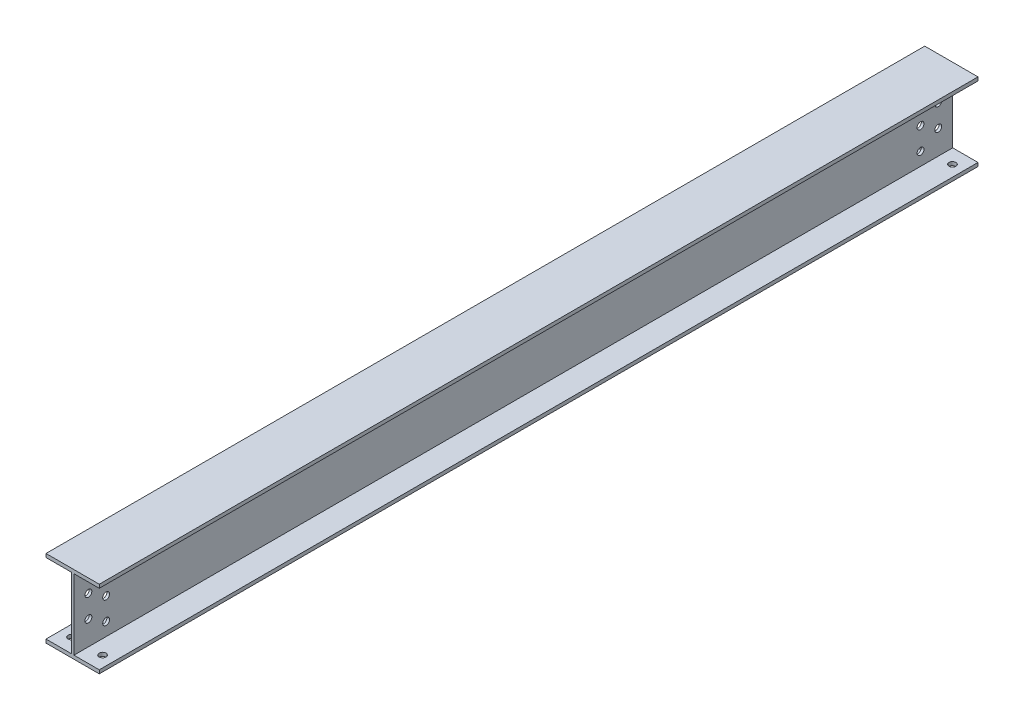
ISO-10303-21;
HEADER;
FILE_DESCRIPTION(('STEP AP214'),'2;1');
FILE_NAME('part.step','',(''),(''),'','','');
FILE_SCHEMA(('AUTOMOTIVE_DESIGN { 1 0 10303 214 1 1 1 1 }'));
ENDSEC;
DATA;
#1=APPLICATION_CONTEXT('core data for automotive mechanical design processes');
#2=APPLICATION_PROTOCOL_DEFINITION('international standard','automotive_design',2000,#1);
#3=PRODUCT_CONTEXT('',#1,'mechanical');
#4=PRODUCT('Part','Part','',(#3));
#5=PRODUCT_RELATED_PRODUCT_CATEGORY('part','',(#4));
#6=PRODUCT_DEFINITION_FORMATION('','',#4);
#7=PRODUCT_DEFINITION_CONTEXT('part definition',#1,'design');
#8=PRODUCT_DEFINITION('design','',#6,#7);
#9=PRODUCT_DEFINITION_SHAPE('','',#8);
#10=(LENGTH_UNIT() NAMED_UNIT(*) SI_UNIT(.MILLI.,.METRE.));
#11=(NAMED_UNIT(*) PLANE_ANGLE_UNIT() SI_UNIT($,.RADIAN.));
#12=(NAMED_UNIT(*) SI_UNIT($,.STERADIAN.) SOLID_ANGLE_UNIT());
#13=UNCERTAINTY_MEASURE_WITH_UNIT(LENGTH_MEASURE(1.E-05),#10,'distance_accuracy_value','');
#14=(GEOMETRIC_REPRESENTATION_CONTEXT(3) GLOBAL_UNCERTAINTY_ASSIGNED_CONTEXT((#13)) GLOBAL_UNIT_ASSIGNED_CONTEXT((#10,
#11,#12)) REPRESENTATION_CONTEXT('',''));
#15=CARTESIAN_POINT('',(0.,0.,0.));
#16=DIRECTION('',(0.,0.,1.));
#17=DIRECTION('',(1.,0.,0.));
#18=AXIS2_PLACEMENT_3D('',#15,#16,#17);
#19=CARTESIAN_POINT('',(-6.00000000000005,-159.,1980.));
#20=DIRECTION('',(1.,0.,0.));
#21=DIRECTION('',(0.,1.,0.));
#22=AXIS2_PLACEMENT_3D('',#19,#20,#21);
#23=PLANE('',#22);
#24=CARTESIAN_POINT('',(-6.00000000000002,50.,-1915.));
#25=DIRECTION('',(1.,0.,0.));
#26=DIRECTION('',(0.,1.,0.));
#27=AXIS2_PLACEMENT_3D('',#24,#25,#26);
#28=CIRCLE('',#27,15.5000000000002);
#29=CARTESIAN_POINT('',(-6.00000000000002,65.5000000000002,-1915.));
#30=VERTEX_POINT('',#29);
#31=EDGE_CURVE('E234',#30,#30,#28,.T.);
#32=ORIENTED_EDGE('',*,*,#31,.T.);
#33=EDGE_LOOP('',(#32));
#34=FACE_BOUND('',#33,.T.);
#35=CARTESIAN_POINT('',(-6.00000000000002,0.,-1835.));
#36=DIRECTION('',(1.,0.,0.));
#37=DIRECTION('',(0.,1.,0.));
#38=AXIS2_PLACEMENT_3D('',#35,#36,#37);
#39=CIRCLE('',#38,15.5000000000002);
#40=CARTESIAN_POINT('',(-6.00000000000002,15.5000000000001,-1835.));
#41=VERTEX_POINT('',#40);
#42=EDGE_CURVE('E231',#41,#41,#39,.T.);
#43=ORIENTED_EDGE('',*,*,#42,.T.);
#44=EDGE_LOOP('',(#43));
#45=FACE_BOUND('',#44,.T.);
#46=CARTESIAN_POINT('',(-6.00000000000001,100.,-1835.));
#47=DIRECTION('',(1.,0.,0.));
#48=DIRECTION('',(0.,1.,0.));
#49=AXIS2_PLACEMENT_3D('',#46,#47,#48);
#50=CIRCLE('',#49,15.5000000000002);
#51=CARTESIAN_POINT('',(-6.,115.5,-1835.));
#52=VERTEX_POINT('',#51);
#53=EDGE_CURVE('E228',#52,#52,#50,.T.);
#54=ORIENTED_EDGE('',*,*,#53,.T.);
#55=EDGE_LOOP('',(#54));
#56=FACE_BOUND('',#55,.T.);
#57=CARTESIAN_POINT('',(-6.00000000000003,-100.,-1835.));
#58=DIRECTION('',(1.,0.,0.));
#59=DIRECTION('',(0.,1.,0.));
#60=AXIS2_PLACEMENT_3D('',#57,#58,#59);
#61=CIRCLE('',#60,15.5000000000002);
#62=CARTESIAN_POINT('',(-6.00000000000003,-84.4999999999999,-1835.));
#63=VERTEX_POINT('',#62);
#64=EDGE_CURVE('E224',#63,#63,#61,.T.);
#65=ORIENTED_EDGE('',*,*,#64,.T.);
#66=EDGE_LOOP('',(#65));
#67=FACE_BOUND('',#66,.T.);
#68=CARTESIAN_POINT('',(-6.00000000000003,-50.,1915.));
#69=DIRECTION('',(1.,0.,0.));
#70=DIRECTION('',(0.,1.,0.));
#71=AXIS2_PLACEMENT_3D('',#68,#69,#70);
#72=CIRCLE('',#71,15.5000000000002);
#73=CARTESIAN_POINT('',(-6.00000000000003,-34.4999999999999,1915.));
#74=VERTEX_POINT('',#73);
#75=EDGE_CURVE('E220',#74,#74,#72,.T.);
#76=ORIENTED_EDGE('',*,*,#75,.T.);
#77=EDGE_LOOP('',(#76));
#78=FACE_BOUND('',#77,.T.);
#79=CARTESIAN_POINT('',(-6.00000000000003,-100.,1835.));
#80=DIRECTION('',(1.,0.,0.));
#81=DIRECTION('',(0.,1.,0.));
#82=AXIS2_PLACEMENT_3D('',#79,#80,#81);
#83=CIRCLE('',#82,15.5000000000002);
#84=CARTESIAN_POINT('',(-6.00000000000003,-84.4999999999999,1835.));
#85=VERTEX_POINT('',#84);
#86=EDGE_CURVE('E216',#85,#85,#83,.T.);
#87=ORIENTED_EDGE('',*,*,#86,.T.);
#88=EDGE_LOOP('',(#87));
#89=FACE_BOUND('',#88,.T.);
#90=CARTESIAN_POINT('',(-6.00000000000003,-50.,-1915.));
#91=DIRECTION('',(1.,0.,0.));
#92=DIRECTION('',(0.,1.,0.));
#93=AXIS2_PLACEMENT_3D('',#90,#91,#92);
#94=CIRCLE('',#93,15.5000000000002);
#95=CARTESIAN_POINT('',(-6.00000000000003,-34.4999999999999,-1915.));
#96=VERTEX_POINT('',#95);
#97=EDGE_CURVE('E212',#96,#96,#94,.T.);
#98=ORIENTED_EDGE('',*,*,#97,.T.);
#99=EDGE_LOOP('',(#98));
#100=FACE_BOUND('',#99,.T.);
#101=CARTESIAN_POINT('',(-6.00000000000001,100.,1835.));
#102=DIRECTION('',(1.,0.,0.));
#103=DIRECTION('',(0.,1.,0.));
#104=AXIS2_PLACEMENT_3D('',#101,#102,#103);
#105=CIRCLE('',#104,15.5000000000002);
#106=CARTESIAN_POINT('',(-6.,115.5,1835.));
#107=VERTEX_POINT('',#106);
#108=EDGE_CURVE('E208',#107,#107,#105,.T.);
#109=ORIENTED_EDGE('',*,*,#108,.T.);
#110=EDGE_LOOP('',(#109));
#111=FACE_BOUND('',#110,.T.);
#112=CARTESIAN_POINT('',(-6.00000000000002,0.,1835.));
#113=DIRECTION('',(1.,0.,0.));
#114=DIRECTION('',(0.,1.,0.));
#115=AXIS2_PLACEMENT_3D('',#112,#113,#114);
#116=CIRCLE('',#115,15.5000000000002);
#117=CARTESIAN_POINT('',(-6.00000000000002,15.5000000000001,1835.));
#118=VERTEX_POINT('',#117);
#119=EDGE_CURVE('E204',#118,#118,#116,.T.);
#120=ORIENTED_EDGE('',*,*,#119,.T.);
#121=EDGE_LOOP('',(#120));
#122=FACE_BOUND('',#121,.T.);
#123=CARTESIAN_POINT('',(-6.00000000000002,50.,1915.));
#124=DIRECTION('',(1.,0.,0.));
#125=DIRECTION('',(0.,1.,0.));
#126=AXIS2_PLACEMENT_3D('',#123,#124,#125);
#127=CIRCLE('',#126,15.5000000000002);
#128=CARTESIAN_POINT('',(-6.00000000000002,65.5000000000002,1915.));
#129=VERTEX_POINT('',#128);
#130=EDGE_CURVE('E158',#129,#129,#127,.T.);
#131=ORIENTED_EDGE('',*,*,#130,.T.);
#132=EDGE_LOOP('',(#131));
#133=FACE_BOUND('',#132,.T.);
#134=DIRECTION('',(0.,-1.,0.));
#135=VECTOR('',#134,1.);
#136=CARTESIAN_POINT('',(-6.00000000000005,-159.,-1980.));
#137=LINE('',#136,#135);
#138=CARTESIAN_POINT('',(-6.,159.,-1980.));
#139=VERTEX_POINT('',#138);
#140=CARTESIAN_POINT('',(-6.00000000000005,-159.,-1980.));
#141=VERTEX_POINT('',#140);
#142=EDGE_CURVE('E154',#139,#141,#137,.T.);
#143=ORIENTED_EDGE('',*,*,#142,.T.);
#144=DIRECTION('',(0.,0.,-1.));
#145=VECTOR('',#144,1.);
#146=CARTESIAN_POINT('',(-6.00000000000005,-159.,1980.));
#147=LINE('',#146,#145);
#148=CARTESIAN_POINT('',(-6.00000000000005,-159.,1980.));
#149=VERTEX_POINT('',#148);
#150=EDGE_CURVE('E11',#149,#141,#147,.T.);
#151=ORIENTED_EDGE('',*,*,#150,.F.);
#152=DIRECTION('',(0.,-1.,0.));
#153=VECTOR('',#152,1.);
#154=CARTESIAN_POINT('',(-6.00000000000005,-159.,1980.));
#155=LINE('',#154,#153);
#156=CARTESIAN_POINT('',(-6.,159.,1980.));
#157=VERTEX_POINT('',#156);
#158=EDGE_CURVE('E177',#157,#149,#155,.T.);
#159=ORIENTED_EDGE('',*,*,#158,.F.);
#160=DIRECTION('',(0.,0.,-1.));
#161=VECTOR('',#160,1.);
#162=CARTESIAN_POINT('',(-6.,159.,1980.));
#163=LINE('',#162,#161);
#164=EDGE_CURVE('E150',#157,#139,#163,.T.);
#165=ORIENTED_EDGE('',*,*,#164,.T.);
#166=EDGE_LOOP('',(#143,#151,#159,#165));
#167=FACE_BOUND('',#166,.T.);
#168=ADVANCED_FACE('F32',(#34,#45,#56,#67,#78,#89,#100,#111,#122,#133,#167),#23,.F.);
#169=CARTESIAN_POINT('',(-120.,-159.,1980.));
#170=DIRECTION('',(0.,-1.,0.));
#171=DIRECTION('',(0.,0.,-1.));
#172=AXIS2_PLACEMENT_3D('',#169,#170,#171);
#173=PLANE('',#172);
#174=CARTESIAN_POINT('',(-70.,-159.,1915.));
#175=DIRECTION('',(0.,1.,0.));
#176=DIRECTION('',(0.,0.,-1.));
#177=AXIS2_PLACEMENT_3D('',#174,#175,#176);
#178=CIRCLE('',#177,15.5);
#179=CARTESIAN_POINT('',(-70.,-159.,1899.5));
#180=VERTEX_POINT('',#179);
#181=EDGE_CURVE('E399',#180,#180,#178,.T.);
#182=ORIENTED_EDGE('',*,*,#181,.F.);
#183=EDGE_LOOP('',(#182));
#184=FACE_BOUND('',#183,.T.);
#185=CARTESIAN_POINT('',(-70.,-159.,-1915.));
#186=DIRECTION('',(0.,1.,0.));
#187=DIRECTION('',(0.,0.,1.));
#188=AXIS2_PLACEMENT_3D('',#185,#186,#187);
#189=CIRCLE('',#188,15.5);
#190=CARTESIAN_POINT('',(-70.,-159.,-1899.5));
#191=VERTEX_POINT('',#190);
#192=EDGE_CURVE('E246',#191,#191,#189,.T.);
#193=ORIENTED_EDGE('',*,*,#192,.F.);
#194=EDGE_LOOP('',(#193));
#195=FACE_BOUND('',#194,.T.);
#196=DIRECTION('',(-1.,0.,0.));
#197=VECTOR('',#196,1.);
#198=CARTESIAN_POINT('',(-120.,-159.,-1980.));
#199=LINE('',#198,#197);
#200=CARTESIAN_POINT('',(-120.,-159.,-1980.));
#201=VERTEX_POINT('',#200);
#202=EDGE_CURVE('E157',#141,#201,#199,.T.);
#203=ORIENTED_EDGE('',*,*,#202,.T.);
#204=DIRECTION('',(0.,0.,-1.));
#205=VECTOR('',#204,1.);
#206=CARTESIAN_POINT('',(-120.,-159.,1980.));
#207=LINE('',#206,#205);
#208=CARTESIAN_POINT('',(-120.,-159.,1980.));
#209=VERTEX_POINT('',#208);
#210=EDGE_CURVE('E41',#209,#201,#207,.T.);
#211=ORIENTED_EDGE('',*,*,#210,.F.);
#212=DIRECTION('',(-1.,0.,0.));
#213=VECTOR('',#212,1.);
#214=CARTESIAN_POINT('',(-120.,-159.,1980.));
#215=LINE('',#214,#213);
#216=EDGE_CURVE('E105',#149,#209,#215,.T.);
#217=ORIENTED_EDGE('',*,*,#216,.F.);
#218=ORIENTED_EDGE('',*,*,#150,.T.);
#219=EDGE_LOOP('',(#203,#211,#217,#218));
#220=FACE_BOUND('',#219,.T.);
#221=ADVANCED_FACE('F306',(#184,#195,#220),#173,.F.);
#222=CARTESIAN_POINT('',(-120.,-175.,1980.));
#223=DIRECTION('',(1.,0.,0.));
#224=DIRECTION('',(0.,0.,-1.));
#225=AXIS2_PLACEMENT_3D('',#222,#223,#224);
#226=PLANE('',#225);
#227=DIRECTION('',(0.,-1.,0.));
#228=VECTOR('',#227,1.);
#229=CARTESIAN_POINT('',(-120.,-175.,-1980.));
#230=LINE('',#229,#228);
#231=CARTESIAN_POINT('',(-120.,-175.,-1980.));
#232=VERTEX_POINT('',#231);
#233=EDGE_CURVE('E160',#201,#232,#230,.T.);
#234=ORIENTED_EDGE('',*,*,#233,.T.);
#235=DIRECTION('',(0.,0.,-1.));
#236=VECTOR('',#235,1.);
#237=CARTESIAN_POINT('',(-120.,-175.,1980.));
#238=LINE('',#237,#236);
#239=CARTESIAN_POINT('',(-120.,-175.,1980.));
#240=VERTEX_POINT('',#239);
#241=EDGE_CURVE('E196',#240,#232,#238,.T.);
#242=ORIENTED_EDGE('',*,*,#241,.F.);
#243=DIRECTION('',(0.,-1.,0.));
#244=VECTOR('',#243,1.);
#245=CARTESIAN_POINT('',(-120.,-175.,1980.));
#246=LINE('',#245,#244);
#247=EDGE_CURVE('E267',#209,#240,#246,.T.);
#248=ORIENTED_EDGE('',*,*,#247,.F.);
#249=ORIENTED_EDGE('',*,*,#210,.T.);
#250=EDGE_LOOP('',(#234,#242,#248,#249));
#251=FACE_BOUND('',#250,.T.);
#252=ADVANCED_FACE('F310',(#251),#226,.F.);
#253=CARTESIAN_POINT('',(120.,-175.,1980.));
#254=DIRECTION('',(0.,1.,0.));
#255=DIRECTION('',(-1.,0.,0.));
#256=AXIS2_PLACEMENT_3D('',#253,#254,#255);
#257=PLANE('',#256);
#258=CARTESIAN_POINT('',(-70.,-175.,1915.));
#259=DIRECTION('',(0.,1.,0.));
#260=DIRECTION('',(0.,0.,-1.));
#261=AXIS2_PLACEMENT_3D('',#258,#259,#260);
#262=CIRCLE('',#261,15.5);
#263=CARTESIAN_POINT('',(-70.,-175.,1899.5));
#264=VERTEX_POINT('',#263);
#265=EDGE_CURVE('E396',#264,#264,#262,.T.);
#266=ORIENTED_EDGE('',*,*,#265,.T.);
#267=EDGE_LOOP('',(#266));
#268=FACE_BOUND('',#267,.T.);
#269=CARTESIAN_POINT('',(70.,-175.,1915.));
#270=DIRECTION('',(0.,1.,0.));
#271=DIRECTION('',(0.,0.,-1.));
#272=AXIS2_PLACEMENT_3D('',#269,#270,#271);
#273=CIRCLE('',#272,15.5);
#274=CARTESIAN_POINT('',(70.,-175.,1899.5));
#275=VERTEX_POINT('',#274);
#276=EDGE_CURVE('E404',#275,#275,#273,.T.);
#277=ORIENTED_EDGE('',*,*,#276,.T.);
#278=EDGE_LOOP('',(#277));
#279=FACE_BOUND('',#278,.T.);
#280=CARTESIAN_POINT('',(70.,-175.,-1915.));
#281=DIRECTION('',(0.,1.,0.));
#282=DIRECTION('',(0.,0.,1.));
#283=AXIS2_PLACEMENT_3D('',#280,#281,#282);
#284=CIRCLE('',#283,15.5);
#285=CARTESIAN_POINT('',(70.,-175.,-1899.5));
#286=VERTEX_POINT('',#285);
#287=EDGE_CURVE('E410',#286,#286,#284,.T.);
#288=ORIENTED_EDGE('',*,*,#287,.T.);
#289=EDGE_LOOP('',(#288));
#290=FACE_BOUND('',#289,.T.);
#291=CARTESIAN_POINT('',(-70.,-175.,-1915.));
#292=DIRECTION('',(0.,1.,0.));
#293=DIRECTION('',(0.,0.,1.));
#294=AXIS2_PLACEMENT_3D('',#291,#292,#293);
#295=CIRCLE('',#294,15.5);
#296=CARTESIAN_POINT('',(-70.,-175.,-1899.5));
#297=VERTEX_POINT('',#296);
#298=EDGE_CURVE('E244',#297,#297,#295,.T.);
#299=ORIENTED_EDGE('',*,*,#298,.T.);
#300=EDGE_LOOP('',(#299));
#301=FACE_BOUND('',#300,.T.);
#302=DIRECTION('',(1.,0.,0.));
#303=VECTOR('',#302,1.);
#304=CARTESIAN_POINT('',(120.,-175.,-1980.));
#305=LINE('',#304,#303);
#306=CARTESIAN_POINT('',(120.,-175.,-1980.));
#307=VERTEX_POINT('',#306);
#308=EDGE_CURVE('E162',#232,#307,#305,.T.);
#309=ORIENTED_EDGE('',*,*,#308,.T.);
#310=DIRECTION('',(0.,0.,-1.));
#311=VECTOR('',#310,1.);
#312=CARTESIAN_POINT('',(120.,-175.,1980.));
#313=LINE('',#312,#311);
#314=CARTESIAN_POINT('',(120.,-175.,1980.));
#315=VERTEX_POINT('',#314);
#316=EDGE_CURVE('E193',#315,#307,#313,.T.);
#317=ORIENTED_EDGE('',*,*,#316,.F.);
#318=DIRECTION('',(1.,0.,0.));
#319=VECTOR('',#318,1.);
#320=CARTESIAN_POINT('',(120.,-175.,1980.));
#321=LINE('',#320,#319);
#322=EDGE_CURVE('E269',#240,#315,#321,.T.);
#323=ORIENTED_EDGE('',*,*,#322,.F.);
#324=ORIENTED_EDGE('',*,*,#241,.T.);
#325=EDGE_LOOP('',(#309,#317,#323,#324));
#326=FACE_BOUND('',#325,.T.);
#327=ADVANCED_FACE('F429',(#268,#279,#290,#301,#326),#257,.F.);
#328=CARTESIAN_POINT('',(120.,-159.,1980.));
#329=DIRECTION('',(-1.,0.,0.));
#330=DIRECTION('',(0.,0.,1.));
#331=AXIS2_PLACEMENT_3D('',#328,#329,#330);
#332=PLANE('',#331);
#333=DIRECTION('',(0.,1.,0.));
#334=VECTOR('',#333,1.);
#335=CARTESIAN_POINT('',(120.,-159.,-1980.));
#336=LINE('',#335,#334);
#337=CARTESIAN_POINT('',(120.,-159.,-1980.));
#338=VERTEX_POINT('',#337);
#339=EDGE_CURVE('E164',#307,#338,#336,.T.);
#340=ORIENTED_EDGE('',*,*,#339,.T.);
#341=DIRECTION('',(0.,0.,-1.));
#342=VECTOR('',#341,1.);
#343=CARTESIAN_POINT('',(120.,-159.,1980.));
#344=LINE('',#343,#342);
#345=CARTESIAN_POINT('',(120.,-159.,1980.));
#346=VERTEX_POINT('',#345);
#347=EDGE_CURVE('E190',#346,#338,#344,.T.);
#348=ORIENTED_EDGE('',*,*,#347,.F.);
#349=DIRECTION('',(0.,1.,0.));
#350=VECTOR('',#349,1.);
#351=CARTESIAN_POINT('',(120.,-159.,1980.));
#352=LINE('',#351,#350);
#353=EDGE_CURVE('E271',#315,#346,#352,.T.);
#354=ORIENTED_EDGE('',*,*,#353,.F.);
#355=ORIENTED_EDGE('',*,*,#316,.T.);
#356=EDGE_LOOP('',(#340,#348,#354,#355));
#357=FACE_BOUND('',#356,.T.);
#358=ADVANCED_FACE('F433',(#357),#332,.F.);
#359=CARTESIAN_POINT('',(6.00000000000005,-159.,1980.));
#360=DIRECTION('',(0.,-1.,0.));
#361=DIRECTION('',(1.,0.,0.));
#362=AXIS2_PLACEMENT_3D('',#359,#360,#361);
#363=PLANE('',#362);
#364=CARTESIAN_POINT('',(70.,-159.,1915.));
#365=DIRECTION('',(0.,1.,0.));
#366=DIRECTION('',(0.,0.,-1.));
#367=AXIS2_PLACEMENT_3D('',#364,#365,#366);
#368=CIRCLE('',#367,15.5);
#369=CARTESIAN_POINT('',(70.,-159.,1899.5));
#370=VERTEX_POINT('',#369);
#371=EDGE_CURVE('E401',#370,#370,#368,.T.);
#372=ORIENTED_EDGE('',*,*,#371,.F.);
#373=EDGE_LOOP('',(#372));
#374=FACE_BOUND('',#373,.T.);
#375=CARTESIAN_POINT('',(70.,-159.,-1915.));
#376=DIRECTION('',(0.,1.,0.));
#377=DIRECTION('',(0.,0.,1.));
#378=AXIS2_PLACEMENT_3D('',#375,#376,#377);
#379=CIRCLE('',#378,15.5);
#380=CARTESIAN_POINT('',(70.,-159.,-1899.5));
#381=VERTEX_POINT('',#380);
#382=EDGE_CURVE('E407',#381,#381,#379,.T.);
#383=ORIENTED_EDGE('',*,*,#382,.F.);
#384=EDGE_LOOP('',(#383));
#385=FACE_BOUND('',#384,.T.);
#386=DIRECTION('',(-1.,0.,0.));
#387=VECTOR('',#386,1.);
#388=CARTESIAN_POINT('',(6.00000000000005,-159.,-1980.));
#389=LINE('',#388,#387);
#390=CARTESIAN_POINT('',(6.00000000000005,-159.,-1980.));
#391=VERTEX_POINT('',#390);
#392=EDGE_CURVE('E166',#338,#391,#389,.T.);
#393=ORIENTED_EDGE('',*,*,#392,.T.);
#394=DIRECTION('',(0.,0.,-1.));
#395=VECTOR('',#394,1.);
#396=CARTESIAN_POINT('',(6.00000000000005,-159.,1980.));
#397=LINE('',#396,#395);
#398=CARTESIAN_POINT('',(6.00000000000005,-159.,1980.));
#399=VERTEX_POINT('',#398);
#400=EDGE_CURVE('E187',#399,#391,#397,.T.);
#401=ORIENTED_EDGE('',*,*,#400,.F.);
#402=DIRECTION('',(-1.,0.,0.));
#403=VECTOR('',#402,1.);
#404=CARTESIAN_POINT('',(6.00000000000005,-159.,1980.));
#405=LINE('',#404,#403);
#406=EDGE_CURVE('E273',#346,#399,#405,.T.);
#407=ORIENTED_EDGE('',*,*,#406,.F.);
#408=ORIENTED_EDGE('',*,*,#347,.T.);
#409=EDGE_LOOP('',(#393,#401,#407,#408));
#410=FACE_BOUND('',#409,.T.);
#411=ADVANCED_FACE('F438',(#374,#385,#410),#363,.F.);
#412=CARTESIAN_POINT('',(6.,159.,1980.));
#413=DIRECTION('',(-1.,0.,0.));
#414=DIRECTION('',(0.,-1.,0.));
#415=AXIS2_PLACEMENT_3D('',#412,#413,#414);
#416=PLANE('',#415);
#417=CARTESIAN_POINT('',(6.00000000000003,50.,-1915.));
#418=DIRECTION('',(-1.,0.,0.));
#419=DIRECTION('',(0.,-1.,0.));
#420=AXIS2_PLACEMENT_3D('',#417,#418,#419);
#421=CIRCLE('',#420,15.5000000000002);
#422=CARTESIAN_POINT('',(6.00000000000004,34.4999999999998,-1915.));
#423=VERTEX_POINT('',#422);
#424=EDGE_CURVE('E35',#423,#423,#421,.T.);
#425=ORIENTED_EDGE('',*,*,#424,.T.);
#426=EDGE_LOOP('',(#425));
#427=FACE_BOUND('',#426,.T.);
#428=CARTESIAN_POINT('',(6.00000000000003,0.,-1835.));
#429=DIRECTION('',(-1.,0.,0.));
#430=DIRECTION('',(0.,-1.,0.));
#431=AXIS2_PLACEMENT_3D('',#428,#429,#430);
#432=CIRCLE('',#431,15.5000000000002);
#433=CARTESIAN_POINT('',(6.00000000000004,-15.5000000000002,-1835.));
#434=VERTEX_POINT('',#433);
#435=EDGE_CURVE('E232',#434,#434,#432,.T.);
#436=ORIENTED_EDGE('',*,*,#435,.T.);
#437=EDGE_LOOP('',(#436));
#438=FACE_BOUND('',#437,.T.);
#439=CARTESIAN_POINT('',(6.00000000000001,100.,-1835.));
#440=DIRECTION('',(-1.,0.,0.));
#441=DIRECTION('',(0.,-1.,0.));
#442=AXIS2_PLACEMENT_3D('',#439,#440,#441);
#443=CIRCLE('',#442,15.5000000000002);
#444=CARTESIAN_POINT('',(6.00000000000001,84.4999999999998,-1835.));
#445=VERTEX_POINT('',#444);
#446=EDGE_CURVE('E229',#445,#445,#443,.T.);
#447=ORIENTED_EDGE('',*,*,#446,.T.);
#448=EDGE_LOOP('',(#447));
#449=FACE_BOUND('',#448,.T.);
#450=CARTESIAN_POINT('',(6.00000000000003,-100.,-1835.));
#451=DIRECTION('',(-1.,0.,0.));
#452=DIRECTION('',(0.,-1.,0.));
#453=AXIS2_PLACEMENT_3D('',#450,#451,#452);
#454=CIRCLE('',#453,15.5000000000002);
#455=CARTESIAN_POINT('',(6.00000000000004,-115.5,-1835.));
#456=VERTEX_POINT('',#455);
#457=EDGE_CURVE('E225',#456,#456,#454,.T.);
#458=ORIENTED_EDGE('',*,*,#457,.T.);
#459=EDGE_LOOP('',(#458));
#460=FACE_BOUND('',#459,.T.);
#461=CARTESIAN_POINT('',(6.00000000000003,-50.,1915.));
#462=DIRECTION('',(-1.,0.,0.));
#463=DIRECTION('',(0.,-1.,0.));
#464=AXIS2_PLACEMENT_3D('',#461,#462,#463);
#465=CIRCLE('',#464,15.5000000000002);
#466=CARTESIAN_POINT('',(6.00000000000004,-65.5000000000002,1915.));
#467=VERTEX_POINT('',#466);
#468=EDGE_CURVE('E221',#467,#467,#465,.T.);
#469=ORIENTED_EDGE('',*,*,#468,.T.);
#470=EDGE_LOOP('',(#469));
#471=FACE_BOUND('',#470,.T.);
#472=CARTESIAN_POINT('',(6.00000000000003,-100.,1835.));
#473=DIRECTION('',(-1.,0.,0.));
#474=DIRECTION('',(0.,-1.,0.));
#475=AXIS2_PLACEMENT_3D('',#472,#473,#474);
#476=CIRCLE('',#475,15.5000000000002);
#477=CARTESIAN_POINT('',(6.00000000000004,-115.5,1835.));
#478=VERTEX_POINT('',#477);
#479=EDGE_CURVE('E217',#478,#478,#476,.T.);
#480=ORIENTED_EDGE('',*,*,#479,.T.);
#481=EDGE_LOOP('',(#480));
#482=FACE_BOUND('',#481,.T.);
#483=CARTESIAN_POINT('',(6.00000000000003,-50.,-1915.));
#484=DIRECTION('',(-1.,0.,0.));
#485=DIRECTION('',(0.,-1.,0.));
#486=AXIS2_PLACEMENT_3D('',#483,#484,#485);
#487=CIRCLE('',#486,15.5000000000002);
#488=CARTESIAN_POINT('',(6.00000000000004,-65.5000000000002,-1915.));
#489=VERTEX_POINT('',#488);
#490=EDGE_CURVE('E213',#489,#489,#487,.T.);
#491=ORIENTED_EDGE('',*,*,#490,.T.);
#492=EDGE_LOOP('',(#491));
#493=FACE_BOUND('',#492,.T.);
#494=CARTESIAN_POINT('',(6.00000000000001,100.,1835.));
#495=DIRECTION('',(-1.,0.,0.));
#496=DIRECTION('',(0.,-1.,0.));
#497=AXIS2_PLACEMENT_3D('',#494,#495,#496);
#498=CIRCLE('',#497,15.5000000000002);
#499=CARTESIAN_POINT('',(6.00000000000001,84.4999999999998,1835.));
#500=VERTEX_POINT('',#499);
#501=EDGE_CURVE('E209',#500,#500,#498,.T.);
#502=ORIENTED_EDGE('',*,*,#501,.T.);
#503=EDGE_LOOP('',(#502));
#504=FACE_BOUND('',#503,.T.);
#505=CARTESIAN_POINT('',(6.00000000000003,0.,1835.));
#506=DIRECTION('',(-1.,0.,0.));
#507=DIRECTION('',(0.,-1.,0.));
#508=AXIS2_PLACEMENT_3D('',#505,#506,#507);
#509=CIRCLE('',#508,15.5000000000002);
#510=CARTESIAN_POINT('',(6.00000000000004,-15.5000000000002,1835.));
#511=VERTEX_POINT('',#510);
#512=EDGE_CURVE('E205',#511,#511,#509,.T.);
#513=ORIENTED_EDGE('',*,*,#512,.T.);
#514=EDGE_LOOP('',(#513));
#515=FACE_BOUND('',#514,.T.);
#516=CARTESIAN_POINT('',(6.00000000000003,50.,1915.));
#517=DIRECTION('',(-1.,0.,0.));
#518=DIRECTION('',(0.,-1.,0.));
#519=AXIS2_PLACEMENT_3D('',#516,#517,#518);
#520=CIRCLE('',#519,15.5000000000002);
#521=CARTESIAN_POINT('',(6.00000000000004,34.4999999999998,1915.));
#522=VERTEX_POINT('',#521);
#523=EDGE_CURVE('E201',#522,#522,#520,.T.);
#524=ORIENTED_EDGE('',*,*,#523,.T.);
#525=EDGE_LOOP('',(#524));
#526=FACE_BOUND('',#525,.T.);
#527=DIRECTION('',(0.,1.,0.));
#528=VECTOR('',#527,1.);
#529=CARTESIAN_POINT('',(6.,159.,-1980.));
#530=LINE('',#529,#528);
#531=CARTESIAN_POINT('',(6.,159.,-1980.));
#532=VERTEX_POINT('',#531);
#533=EDGE_CURVE('E168',#391,#532,#530,.T.);
#534=ORIENTED_EDGE('',*,*,#533,.T.);
#535=DIRECTION('',(0.,0.,-1.));
#536=VECTOR('',#535,1.);
#537=CARTESIAN_POINT('',(6.,159.,1980.));
#538=LINE('',#537,#536);
#539=CARTESIAN_POINT('',(6.,159.,1980.));
#540=VERTEX_POINT('',#539);
#541=EDGE_CURVE('E184',#540,#532,#538,.T.);
#542=ORIENTED_EDGE('',*,*,#541,.F.);
#543=DIRECTION('',(0.,1.,0.));
#544=VECTOR('',#543,1.);
#545=CARTESIAN_POINT('',(6.,159.,1980.));
#546=LINE('',#545,#544);
#547=EDGE_CURVE('E275',#399,#540,#546,.T.);
#548=ORIENTED_EDGE('',*,*,#547,.F.);
#549=ORIENTED_EDGE('',*,*,#400,.T.);
#550=EDGE_LOOP('',(#534,#542,#548,#549));
#551=FACE_BOUND('',#550,.T.);
#552=ADVANCED_FACE('F441',(#427,#438,#449,#460,#471,#482,#493,#504,#515,#526,#551),#416,.F.);
#553=CARTESIAN_POINT('',(120.,159.,1980.));
#554=DIRECTION('',(0.,1.,0.));
#555=DIRECTION('',(0.,0.,1.));
#556=AXIS2_PLACEMENT_3D('',#553,#554,#555);
#557=PLANE('',#556);
#558=DIRECTION('',(1.,0.,0.));
#559=VECTOR('',#558,1.);
#560=CARTESIAN_POINT('',(120.,159.,-1980.));
#561=LINE('',#560,#559);
#562=CARTESIAN_POINT('',(120.,159.,-1980.));
#563=VERTEX_POINT('',#562);
#564=EDGE_CURVE('E170',#532,#563,#561,.T.);
#565=ORIENTED_EDGE('',*,*,#564,.T.);
#566=DIRECTION('',(0.,0.,-1.));
#567=VECTOR('',#566,1.);
#568=CARTESIAN_POINT('',(120.,159.,1980.));
#569=LINE('',#568,#567);
#570=CARTESIAN_POINT('',(120.,159.,1980.));
#571=VERTEX_POINT('',#570);
#572=EDGE_CURVE('E181',#571,#563,#569,.T.);
#573=ORIENTED_EDGE('',*,*,#572,.F.);
#574=DIRECTION('',(1.,0.,0.));
#575=VECTOR('',#574,1.);
#576=CARTESIAN_POINT('',(120.,159.,1980.));
#577=LINE('',#576,#575);
#578=EDGE_CURVE('E277',#540,#571,#577,.T.);
#579=ORIENTED_EDGE('',*,*,#578,.F.);
#580=ORIENTED_EDGE('',*,*,#541,.T.);
#581=EDGE_LOOP('',(#565,#573,#579,#580));
#582=FACE_BOUND('',#581,.T.);
#583=ADVANCED_FACE('F283',(#582),#557,.F.);
#584=CARTESIAN_POINT('',(120.,175.,1980.));
#585=DIRECTION('',(-1.,0.,0.));
#586=DIRECTION('',(0.,0.,1.));
#587=AXIS2_PLACEMENT_3D('',#584,#585,#586);
#588=PLANE('',#587);
#589=DIRECTION('',(0.,1.,0.));
#590=VECTOR('',#589,1.);
#591=CARTESIAN_POINT('',(120.,175.,-1980.));
#592=LINE('',#591,#590);
#593=CARTESIAN_POINT('',(120.,175.,-1980.));
#594=VERTEX_POINT('',#593);
#595=EDGE_CURVE('E172',#563,#594,#592,.T.);
#596=ORIENTED_EDGE('',*,*,#595,.T.);
#597=DIRECTION('',(0.,0.,-1.));
#598=VECTOR('',#597,1.);
#599=CARTESIAN_POINT('',(120.,175.,1980.));
#600=LINE('',#599,#598);
#601=CARTESIAN_POINT('',(120.,175.,1980.));
#602=VERTEX_POINT('',#601);
#603=EDGE_CURVE('E145',#602,#594,#600,.T.);
#604=ORIENTED_EDGE('',*,*,#603,.F.);
#605=DIRECTION('',(0.,1.,0.));
#606=VECTOR('',#605,1.);
#607=CARTESIAN_POINT('',(120.,175.,1980.));
#608=LINE('',#607,#606);
#609=EDGE_CURVE('E136',#571,#602,#608,.T.);
#610=ORIENTED_EDGE('',*,*,#609,.F.);
#611=ORIENTED_EDGE('',*,*,#572,.T.);
#612=EDGE_LOOP('',(#596,#604,#610,#611));
#613=FACE_BOUND('',#612,.T.);
#614=ADVANCED_FACE('F287',(#613),#588,.F.);
#615=CARTESIAN_POINT('',(-120.,175.,1980.));
#616=DIRECTION('',(0.,-1.,0.));
#617=DIRECTION('',(0.,0.,-1.));
#618=AXIS2_PLACEMENT_3D('',#615,#616,#617);
#619=PLANE('',#618);
#620=DIRECTION('',(-1.,0.,0.));
#621=VECTOR('',#620,1.);
#622=CARTESIAN_POINT('',(-120.,175.,-1980.));
#623=LINE('',#622,#621);
#624=CARTESIAN_POINT('',(-120.,175.,-1980.));
#625=VERTEX_POINT('',#624);
#626=EDGE_CURVE('E144',#594,#625,#623,.T.);
#627=ORIENTED_EDGE('',*,*,#626,.T.);
#628=DIRECTION('',(0.,0.,-1.));
#629=VECTOR('',#628,1.);
#630=CARTESIAN_POINT('',(-120.,175.,1980.));
#631=LINE('',#630,#629);
#632=CARTESIAN_POINT('',(-120.,175.,1980.));
#633=VERTEX_POINT('',#632);
#634=EDGE_CURVE('E141',#633,#625,#631,.T.);
#635=ORIENTED_EDGE('',*,*,#634,.F.);
#636=DIRECTION('',(-1.,0.,0.));
#637=VECTOR('',#636,1.);
#638=CARTESIAN_POINT('',(-120.,175.,1980.));
#639=LINE('',#638,#637);
#640=EDGE_CURVE('E130',#602,#633,#639,.T.);
#641=ORIENTED_EDGE('',*,*,#640,.F.);
#642=ORIENTED_EDGE('',*,*,#603,.T.);
#643=EDGE_LOOP('',(#627,#635,#641,#642));
#644=FACE_BOUND('',#643,.T.);
#645=ADVANCED_FACE('F142',(#644),#619,.F.);
#646=CARTESIAN_POINT('',(-120.,159.,1980.));
#647=DIRECTION('',(1.,0.,0.));
#648=DIRECTION('',(0.,0.,-1.));
#649=AXIS2_PLACEMENT_3D('',#646,#647,#648);
#650=PLANE('',#649);
#651=DIRECTION('',(0.,-1.,0.));
#652=VECTOR('',#651,1.);
#653=CARTESIAN_POINT('',(-120.,159.,-1980.));
#654=LINE('',#653,#652);
#655=CARTESIAN_POINT('',(-120.,159.,-1980.));
#656=VERTEX_POINT('',#655);
#657=EDGE_CURVE('E91',#625,#656,#654,.T.);
#658=ORIENTED_EDGE('',*,*,#657,.T.);
#659=DIRECTION('',(0.,0.,-1.));
#660=VECTOR('',#659,1.);
#661=CARTESIAN_POINT('',(-120.,159.,1980.));
#662=LINE('',#661,#660);
#663=CARTESIAN_POINT('',(-120.,159.,1980.));
#664=VERTEX_POINT('',#663);
#665=EDGE_CURVE('E146',#664,#656,#662,.T.);
#666=ORIENTED_EDGE('',*,*,#665,.F.);
#667=DIRECTION('',(0.,-1.,0.));
#668=VECTOR('',#667,1.);
#669=CARTESIAN_POINT('',(-120.,159.,1980.));
#670=LINE('',#669,#668);
#671=EDGE_CURVE('E134',#633,#664,#670,.T.);
#672=ORIENTED_EDGE('',*,*,#671,.F.);
#673=ORIENTED_EDGE('',*,*,#634,.T.);
#674=EDGE_LOOP('',(#658,#666,#672,#673));
#675=FACE_BOUND('',#674,.T.);
#676=ADVANCED_FACE('F148',(#675),#650,.F.);
#677=CARTESIAN_POINT('',(-6.,159.,1980.));
#678=DIRECTION('',(0.,1.,0.));
#679=DIRECTION('',(0.,0.,1.));
#680=AXIS2_PLACEMENT_3D('',#677,#678,#679);
#681=PLANE('',#680);
#682=DIRECTION('',(1.,0.,0.));
#683=VECTOR('',#682,1.);
#684=CARTESIAN_POINT('',(-6.,159.,-1980.));
#685=LINE('',#684,#683);
#686=EDGE_CURVE('E97',#656,#139,#685,.T.);
#687=ORIENTED_EDGE('',*,*,#686,.T.);
#688=ORIENTED_EDGE('',*,*,#164,.F.);
#689=DIRECTION('',(1.,0.,0.));
#690=VECTOR('',#689,1.);
#691=CARTESIAN_POINT('',(-6.,159.,1980.));
#692=LINE('',#691,#690);
#693=EDGE_CURVE('E50',#664,#157,#692,.T.);
#694=ORIENTED_EDGE('',*,*,#693,.F.);
#695=ORIENTED_EDGE('',*,*,#665,.T.);
#696=EDGE_LOOP('',(#687,#688,#694,#695));
#697=FACE_BOUND('',#696,.T.);
#698=ADVANCED_FACE('F295',(#697),#681,.F.);
#699=CARTESIAN_POINT('',(-6.,159.,1980.));
#700=DIRECTION('',(0.,0.,1.));
#701=DIRECTION('',(1.,0.,0.));
#702=AXIS2_PLACEMENT_3D('',#699,#700,#701);
#703=PLANE('',#702);
#704=ORIENTED_EDGE('',*,*,#158,.T.);
#705=ORIENTED_EDGE('',*,*,#216,.T.);
#706=ORIENTED_EDGE('',*,*,#247,.T.);
#707=ORIENTED_EDGE('',*,*,#322,.T.);
#708=ORIENTED_EDGE('',*,*,#353,.T.);
#709=ORIENTED_EDGE('',*,*,#406,.T.);
#710=ORIENTED_EDGE('',*,*,#547,.T.);
#711=ORIENTED_EDGE('',*,*,#578,.T.);
#712=ORIENTED_EDGE('',*,*,#609,.T.);
#713=ORIENTED_EDGE('',*,*,#640,.T.);
#714=ORIENTED_EDGE('',*,*,#671,.T.);
#715=ORIENTED_EDGE('',*,*,#693,.T.);
#716=EDGE_LOOP('',(#704,#705,#706,#707,#708,#709,#710,#711,#712,#713,#714,#715));
#717=FACE_BOUND('',#716,.T.);
#718=ADVANCED_FACE('F132',(#717),#703,.T.);
#719=CARTESIAN_POINT('',(-6.,159.,-1980.));
#720=DIRECTION('',(0.,0.,1.));
#721=DIRECTION('',(1.,0.,0.));
#722=AXIS2_PLACEMENT_3D('',#719,#720,#721);
#723=PLANE('',#722);
#724=ORIENTED_EDGE('',*,*,#142,.F.);
#725=ORIENTED_EDGE('',*,*,#686,.F.);
#726=ORIENTED_EDGE('',*,*,#657,.F.);
#727=ORIENTED_EDGE('',*,*,#626,.F.);
#728=ORIENTED_EDGE('',*,*,#595,.F.);
#729=ORIENTED_EDGE('',*,*,#564,.F.);
#730=ORIENTED_EDGE('',*,*,#533,.F.);
#731=ORIENTED_EDGE('',*,*,#392,.F.);
#732=ORIENTED_EDGE('',*,*,#339,.F.);
#733=ORIENTED_EDGE('',*,*,#308,.F.);
#734=ORIENTED_EDGE('',*,*,#233,.F.);
#735=ORIENTED_EDGE('',*,*,#202,.F.);
#736=EDGE_LOOP('',(#724,#725,#726,#727,#728,#729,#730,#731,#732,#733,#734,#735));
#737=FACE_BOUND('',#736,.T.);
#738=ADVANCED_FACE('F290',(#737),#723,.F.);
#739=CARTESIAN_POINT('',(-120.,50.,1915.));
#740=DIRECTION('',(1.,0.,0.));
#741=DIRECTION('',(0.,0.,-1.));
#742=AXIS2_PLACEMENT_3D('',#739,#740,#741);
#743=CYLINDRICAL_SURFACE('',#742,15.5000000000002);
#744=ORIENTED_EDGE('',*,*,#523,.F.);
#745=EDGE_LOOP('',(#744));
#746=FACE_BOUND('',#745,.T.);
#747=ORIENTED_EDGE('',*,*,#130,.F.);
#748=EDGE_LOOP('',(#747));
#749=FACE_BOUND('',#748,.T.);
#750=ADVANCED_FACE('F331',(#746,#749),#743,.F.);
#751=CARTESIAN_POINT('',(-120.,0.,1835.));
#752=DIRECTION('',(1.,0.,0.));
#753=DIRECTION('',(0.,0.,-1.));
#754=AXIS2_PLACEMENT_3D('',#751,#752,#753);
#755=CYLINDRICAL_SURFACE('',#754,15.5000000000002);
#756=ORIENTED_EDGE('',*,*,#512,.F.);
#757=EDGE_LOOP('',(#756));
#758=FACE_BOUND('',#757,.T.);
#759=ORIENTED_EDGE('',*,*,#119,.F.);
#760=EDGE_LOOP('',(#759));
#761=FACE_BOUND('',#760,.T.);
#762=ADVANCED_FACE('F333',(#758,#761),#755,.F.);
#763=CARTESIAN_POINT('',(-120.,100.,1835.));
#764=DIRECTION('',(1.,0.,0.));
#765=DIRECTION('',(0.,0.,-1.));
#766=AXIS2_PLACEMENT_3D('',#763,#764,#765);
#767=CYLINDRICAL_SURFACE('',#766,15.5000000000002);
#768=ORIENTED_EDGE('',*,*,#501,.F.);
#769=EDGE_LOOP('',(#768));
#770=FACE_BOUND('',#769,.T.);
#771=ORIENTED_EDGE('',*,*,#108,.F.);
#772=EDGE_LOOP('',(#771));
#773=FACE_BOUND('',#772,.T.);
#774=ADVANCED_FACE('F340',(#770,#773),#767,.F.);
#775=CARTESIAN_POINT('',(-120.,-50.,-1915.));
#776=DIRECTION('',(1.,0.,0.));
#777=DIRECTION('',(0.,0.,-1.));
#778=AXIS2_PLACEMENT_3D('',#775,#776,#777);
#779=CYLINDRICAL_SURFACE('',#778,15.5000000000002);
#780=ORIENTED_EDGE('',*,*,#490,.F.);
#781=EDGE_LOOP('',(#780));
#782=FACE_BOUND('',#781,.T.);
#783=ORIENTED_EDGE('',*,*,#97,.F.);
#784=EDGE_LOOP('',(#783));
#785=FACE_BOUND('',#784,.T.);
#786=ADVANCED_FACE('F347',(#782,#785),#779,.F.);
#787=CARTESIAN_POINT('',(-120.,-100.,1835.));
#788=DIRECTION('',(1.,0.,0.));
#789=DIRECTION('',(0.,0.,-1.));
#790=AXIS2_PLACEMENT_3D('',#787,#788,#789);
#791=CYLINDRICAL_SURFACE('',#790,15.5000000000002);
#792=ORIENTED_EDGE('',*,*,#479,.F.);
#793=EDGE_LOOP('',(#792));
#794=FACE_BOUND('',#793,.T.);
#795=ORIENTED_EDGE('',*,*,#86,.F.);
#796=EDGE_LOOP('',(#795));
#797=FACE_BOUND('',#796,.T.);
#798=ADVANCED_FACE('F351',(#794,#797),#791,.F.);
#799=CARTESIAN_POINT('',(-120.,-50.,1915.));
#800=DIRECTION('',(1.,0.,0.));
#801=DIRECTION('',(0.,0.,-1.));
#802=AXIS2_PLACEMENT_3D('',#799,#800,#801);
#803=CYLINDRICAL_SURFACE('',#802,15.5000000000002);
#804=ORIENTED_EDGE('',*,*,#468,.F.);
#805=EDGE_LOOP('',(#804));
#806=FACE_BOUND('',#805,.T.);
#807=ORIENTED_EDGE('',*,*,#75,.F.);
#808=EDGE_LOOP('',(#807));
#809=FACE_BOUND('',#808,.T.);
#810=ADVANCED_FACE('F355',(#806,#809),#803,.F.);
#811=CARTESIAN_POINT('',(-120.,-100.,-1835.));
#812=DIRECTION('',(1.,0.,0.));
#813=DIRECTION('',(0.,0.,-1.));
#814=AXIS2_PLACEMENT_3D('',#811,#812,#813);
#815=CYLINDRICAL_SURFACE('',#814,15.5000000000002);
#816=ORIENTED_EDGE('',*,*,#457,.F.);
#817=EDGE_LOOP('',(#816));
#818=FACE_BOUND('',#817,.T.);
#819=ORIENTED_EDGE('',*,*,#64,.F.);
#820=EDGE_LOOP('',(#819));
#821=FACE_BOUND('',#820,.T.);
#822=ADVANCED_FACE('F359',(#818,#821),#815,.F.);
#823=CARTESIAN_POINT('',(-120.,100.,-1835.));
#824=DIRECTION('',(1.,0.,0.));
#825=DIRECTION('',(0.,0.,-1.));
#826=AXIS2_PLACEMENT_3D('',#823,#824,#825);
#827=CYLINDRICAL_SURFACE('',#826,15.5000000000002);
#828=ORIENTED_EDGE('',*,*,#446,.F.);
#829=EDGE_LOOP('',(#828));
#830=FACE_BOUND('',#829,.T.);
#831=ORIENTED_EDGE('',*,*,#53,.F.);
#832=EDGE_LOOP('',(#831));
#833=FACE_BOUND('',#832,.T.);
#834=ADVANCED_FACE('F363',(#830,#833),#827,.F.);
#835=CARTESIAN_POINT('',(-120.,0.,-1835.));
#836=DIRECTION('',(1.,0.,0.));
#837=DIRECTION('',(0.,0.,-1.));
#838=AXIS2_PLACEMENT_3D('',#835,#836,#837);
#839=CYLINDRICAL_SURFACE('',#838,15.5000000000002);
#840=ORIENTED_EDGE('',*,*,#435,.F.);
#841=EDGE_LOOP('',(#840));
#842=FACE_BOUND('',#841,.T.);
#843=ORIENTED_EDGE('',*,*,#42,.F.);
#844=EDGE_LOOP('',(#843));
#845=FACE_BOUND('',#844,.T.);
#846=ADVANCED_FACE('F367',(#842,#845),#839,.F.);
#847=CARTESIAN_POINT('',(-120.,50.,-1915.));
#848=DIRECTION('',(1.,0.,0.));
#849=DIRECTION('',(0.,0.,-1.));
#850=AXIS2_PLACEMENT_3D('',#847,#848,#849);
#851=CYLINDRICAL_SURFACE('',#850,15.5000000000002);
#852=ORIENTED_EDGE('',*,*,#424,.F.);
#853=EDGE_LOOP('',(#852));
#854=FACE_BOUND('',#853,.T.);
#855=ORIENTED_EDGE('',*,*,#31,.F.);
#856=EDGE_LOOP('',(#855));
#857=FACE_BOUND('',#856,.T.);
#858=ADVANCED_FACE('F371',(#854,#857),#851,.F.);
#859=CARTESIAN_POINT('',(-70.,-175.,-1915.));
#860=DIRECTION('',(0.,1.,0.));
#861=DIRECTION('',(0.,0.,1.));
#862=AXIS2_PLACEMENT_3D('',#859,#860,#861);
#863=CYLINDRICAL_SURFACE('',#862,15.5);
#864=ORIENTED_EDGE('',*,*,#298,.F.);
#865=EDGE_LOOP('',(#864));
#866=FACE_BOUND('',#865,.T.);
#867=ORIENTED_EDGE('',*,*,#192,.T.);
#868=EDGE_LOOP('',(#867));
#869=FACE_BOUND('',#868,.T.);
#870=ADVANCED_FACE('F375',(#866,#869),#863,.F.);
#871=CARTESIAN_POINT('',(70.,-175.,-1915.));
#872=DIRECTION('',(0.,1.,0.));
#873=DIRECTION('',(0.,0.,1.));
#874=AXIS2_PLACEMENT_3D('',#871,#872,#873);
#875=CYLINDRICAL_SURFACE('',#874,15.5);
#876=ORIENTED_EDGE('',*,*,#287,.F.);
#877=EDGE_LOOP('',(#876));
#878=FACE_BOUND('',#877,.T.);
#879=ORIENTED_EDGE('',*,*,#382,.T.);
#880=EDGE_LOOP('',(#879));
#881=FACE_BOUND('',#880,.T.);
#882=ADVANCED_FACE('F379',(#878,#881),#875,.F.);
#883=CARTESIAN_POINT('',(70.,-175.,1915.));
#884=DIRECTION('',(0.,1.,0.));
#885=DIRECTION('',(0.,0.,1.));
#886=AXIS2_PLACEMENT_3D('',#883,#884,#885);
#887=CYLINDRICAL_SURFACE('',#886,15.5);
#888=ORIENTED_EDGE('',*,*,#276,.F.);
#889=EDGE_LOOP('',(#888));
#890=FACE_BOUND('',#889,.T.);
#891=ORIENTED_EDGE('',*,*,#371,.T.);
#892=EDGE_LOOP('',(#891));
#893=FACE_BOUND('',#892,.T.);
#894=ADVANCED_FACE('F383',(#890,#893),#887,.F.);
#895=CARTESIAN_POINT('',(-70.,-175.,1915.));
#896=DIRECTION('',(0.,1.,0.));
#897=DIRECTION('',(0.,0.,1.));
#898=AXIS2_PLACEMENT_3D('',#895,#896,#897);
#899=CYLINDRICAL_SURFACE('',#898,15.5);
#900=ORIENTED_EDGE('',*,*,#265,.F.);
#901=EDGE_LOOP('',(#900));
#902=FACE_BOUND('',#901,.T.);
#903=ORIENTED_EDGE('',*,*,#181,.T.);
#904=EDGE_LOOP('',(#903));
#905=FACE_BOUND('',#904,.T.);
#906=ADVANCED_FACE('F387',(#902,#905),#899,.F.);
#907=CLOSED_SHELL('',(#168,#221,#252,#327,#358,#411,#552,#583,#614,#645,#676,#698,#718,#738,
#750,#762,#774,#786,#798,#810,#822,#834,#846,#858,#870,#882,#894,#906));
#908=MANIFOLD_SOLID_BREP('B2',#907);
#909=ADVANCED_BREP_SHAPE_REPRESENTATION('',(#18,#908),#14);
#910=SHAPE_DEFINITION_REPRESENTATION(#9,#909);
ENDSEC;
END-ISO-10303-21;
